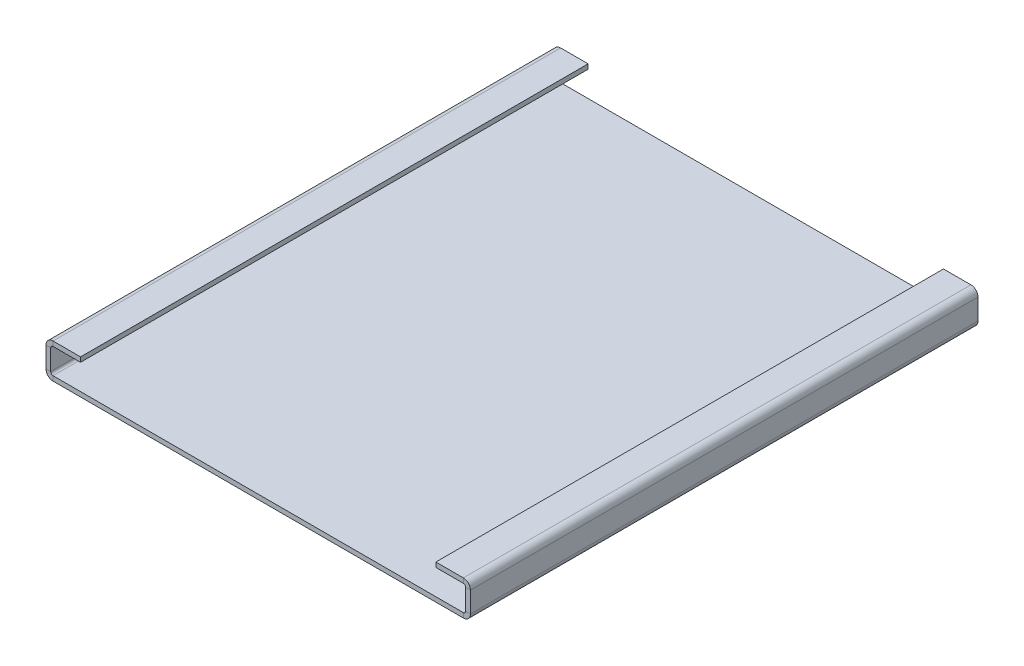
ISO-10303-21;
HEADER;
FILE_DESCRIPTION(('STEP AP214'),'2;1');
FILE_NAME('part.step','',(''),(''),'','','');
FILE_SCHEMA(('AUTOMOTIVE_DESIGN { 1 0 10303 214 1 1 1 1 }'));
ENDSEC;
DATA;
#1=APPLICATION_CONTEXT('core data for automotive mechanical design processes');
#2=APPLICATION_PROTOCOL_DEFINITION('international standard','automotive_design',2000,#1);
#3=PRODUCT_CONTEXT('',#1,'mechanical');
#4=PRODUCT('Part','Part','',(#3));
#5=PRODUCT_RELATED_PRODUCT_CATEGORY('part','',(#4));
#6=PRODUCT_DEFINITION_FORMATION('','',#4);
#7=PRODUCT_DEFINITION_CONTEXT('part definition',#1,'design');
#8=PRODUCT_DEFINITION('design','',#6,#7);
#9=PRODUCT_DEFINITION_SHAPE('','',#8);
#10=(LENGTH_UNIT() NAMED_UNIT(*) SI_UNIT(.MILLI.,.METRE.));
#11=(NAMED_UNIT(*) PLANE_ANGLE_UNIT() SI_UNIT($,.RADIAN.));
#12=(NAMED_UNIT(*) SI_UNIT($,.STERADIAN.) SOLID_ANGLE_UNIT());
#13=UNCERTAINTY_MEASURE_WITH_UNIT(LENGTH_MEASURE(1.E-05),#10,'distance_accuracy_value','');
#14=(GEOMETRIC_REPRESENTATION_CONTEXT(3) GLOBAL_UNCERTAINTY_ASSIGNED_CONTEXT((#13)) GLOBAL_UNIT_ASSIGNED_CONTEXT((#10,
#11,#12)) REPRESENTATION_CONTEXT('',''));
#15=CARTESIAN_POINT('',(0.,0.,0.));
#16=DIRECTION('',(0.,0.,1.));
#17=DIRECTION('',(1.,0.,0.));
#18=AXIS2_PLACEMENT_3D('',#15,#16,#17);
#19=CARTESIAN_POINT('',(17.653,0.,-21.59));
#20=DIRECTION('',(0.,0.,1.));
#21=DIRECTION('',(0.,-1.,0.));
#22=AXIS2_PLACEMENT_3D('',#19,#20,#21);
#23=PLANE('',#22);
#24=DIRECTION('',(-1.,0.,0.));
#25=VECTOR('',#24,1.);
#26=CARTESIAN_POINT('',(17.653,1.958999892,-21.59));
#27=LINE('',#26,#25);
#28=CARTESIAN_POINT('',(18.052999962,1.958999892,-21.59));
#29=VERTEX_POINT('',#28);
#30=CARTESIAN_POINT('',(17.653,1.958999892,-21.59));
#31=VERTEX_POINT('',#30);
#32=EDGE_CURVE('E13',#29,#31,#27,.T.);
#33=ORIENTED_EDGE('',*,*,#32,.F.);
#34=DIRECTION('',(0.,1.,0.));
#35=VECTOR('',#34,1.);
#36=CARTESIAN_POINT('',(18.052999962,0.,-21.59));
#37=LINE('',#36,#35);
#38=CARTESIAN_POINT('',(18.052999962,0.200000107999998,-21.59));
#39=VERTEX_POINT('',#38);
#40=EDGE_CURVE('E137',#29,#39,#37,.F.);
#41=ORIENTED_EDGE('',*,*,#40,.T.);
#42=DIRECTION('',(-1.,0.,0.));
#43=VECTOR('',#42,1.);
#44=CARTESIAN_POINT('',(17.653,0.200000107999998,-21.59));
#45=LINE('',#44,#43);
#46=CARTESIAN_POINT('',(17.653,0.200000107999998,-21.59));
#47=VERTEX_POINT('',#46);
#48=EDGE_CURVE('E61',#39,#47,#45,.T.);
#49=ORIENTED_EDGE('',*,*,#48,.T.);
#50=DIRECTION('',(0.,-1.,0.));
#51=VECTOR('',#50,1.);
#52=CARTESIAN_POINT('',(17.653,0.,-21.59));
#53=LINE('',#52,#51);
#54=EDGE_CURVE('E140',#31,#47,#53,.T.);
#55=ORIENTED_EDGE('',*,*,#54,.F.);
#56=EDGE_LOOP('',(#33,#41,#49,#55));
#57=FACE_BOUND('',#56,.T.);
#58=ADVANCED_FACE('F51',(#57),#23,.F.);
#59=CARTESIAN_POINT('',(17.452999892,0.200000107999998,-21.59));
#60=DIRECTION('',(0.,0.,-1.));
#61=DIRECTION('',(-1.,0.,0.));
#62=AXIS2_PLACEMENT_3D('',#59,#60,#61);
#63=PLANE('',#62);
#64=ORIENTED_EDGE('',*,*,#48,.F.);
#65=CARTESIAN_POINT('',(17.452999892,0.200000107999998,-21.59));
#66=DIRECTION('',(0.,0.,1.));
#67=DIRECTION('',(1.,0.,0.));
#68=AXIS2_PLACEMENT_3D('',#65,#66,#67);
#69=CIRCLE('',#68,0.60000007);
#70=CARTESIAN_POINT('',(17.452999892,-0.399999962000002,-21.59));
#71=VERTEX_POINT('',#70);
#72=EDGE_CURVE('E179',#39,#71,#69,.F.);
#73=ORIENTED_EDGE('',*,*,#72,.T.);
#74=DIRECTION('',(0.,1.,0.));
#75=VECTOR('',#74,1.);
#76=CARTESIAN_POINT('',(17.452999892,0.,-21.59));
#77=LINE('',#76,#75);
#78=CARTESIAN_POINT('',(17.452999892,0.,-21.59));
#79=VERTEX_POINT('',#78);
#80=EDGE_CURVE('E228',#71,#79,#77,.T.);
#81=ORIENTED_EDGE('',*,*,#80,.T.);
#82=CARTESIAN_POINT('',(17.452999892,0.200000107999998,-21.59));
#83=DIRECTION('',(0.,0.,1.));
#84=DIRECTION('',(1.,0.,0.));
#85=AXIS2_PLACEMENT_3D('',#82,#83,#84);
#86=CIRCLE('',#85,0.200000108);
#87=EDGE_CURVE('E250',#47,#79,#86,.F.);
#88=ORIENTED_EDGE('',*,*,#87,.F.);
#89=EDGE_LOOP('',(#64,#73,#81,#88));
#90=FACE_BOUND('',#89,.T.);
#91=ADVANCED_FACE('F251',(#90),#63,.T.);
#92=CARTESIAN_POINT('',(17.653,0.,-21.59));
#93=DIRECTION('',(0.,0.,1.));
#94=DIRECTION('',(-1.,0.,0.));
#95=AXIS2_PLACEMENT_3D('',#92,#93,#94);
#96=PLANE('',#95);
#97=ORIENTED_EDGE('',*,*,#80,.F.);
#98=DIRECTION('',(1.,0.,0.));
#99=VECTOR('',#98,1.);
#100=CARTESIAN_POINT('',(17.653,-0.399999962000002,-21.59));
#101=LINE('',#100,#99);
#102=CARTESIAN_POINT('',(-17.452999892,-0.399999962000007,-21.59));
#103=VERTEX_POINT('',#102);
#104=EDGE_CURVE('E324',#71,#103,#101,.F.);
#105=ORIENTED_EDGE('',*,*,#104,.T.);
#106=DIRECTION('',(0.,1.,0.));
#107=VECTOR('',#106,1.);
#108=CARTESIAN_POINT('',(-17.452999892,0.,-21.59));
#109=LINE('',#108,#107);
#110=CARTESIAN_POINT('',(-17.452999892,0.,-21.59));
#111=VERTEX_POINT('',#110);
#112=EDGE_CURVE('E225',#103,#111,#109,.T.);
#113=ORIENTED_EDGE('',*,*,#112,.T.);
#114=DIRECTION('',(-1.,0.,0.));
#115=VECTOR('',#114,1.);
#116=CARTESIAN_POINT('',(17.653,0.,-21.59));
#117=LINE('',#116,#115);
#118=EDGE_CURVE('E363',#79,#111,#117,.T.);
#119=ORIENTED_EDGE('',*,*,#118,.F.);
#120=EDGE_LOOP('',(#97,#105,#113,#119));
#121=FACE_BOUND('',#120,.T.);
#122=ADVANCED_FACE('F360',(#121),#96,.F.);
#123=CARTESIAN_POINT('',(-17.452999892,0.200000107999993,-21.59));
#124=DIRECTION('',(0.,0.,-1.));
#125=DIRECTION('',(-1.,0.,0.));
#126=AXIS2_PLACEMENT_3D('',#123,#124,#125);
#127=PLANE('',#126);
#128=ORIENTED_EDGE('',*,*,#112,.F.);
#129=CARTESIAN_POINT('',(-17.452999892,0.200000107999993,-21.59));
#130=DIRECTION('',(0.,0.,1.));
#131=DIRECTION('',(1.,0.,0.));
#132=AXIS2_PLACEMENT_3D('',#129,#130,#131);
#133=CIRCLE('',#132,0.60000007);
#134=CARTESIAN_POINT('',(-18.052999962,0.200000107999994,-21.59));
#135=VERTEX_POINT('',#134);
#136=EDGE_CURVE('E328',#103,#135,#133,.F.);
#137=ORIENTED_EDGE('',*,*,#136,.T.);
#138=DIRECTION('',(1.,0.,0.));
#139=VECTOR('',#138,1.);
#140=CARTESIAN_POINT('',(-17.653,0.200000107999993,-21.59));
#141=LINE('',#140,#139);
#142=CARTESIAN_POINT('',(-17.653,0.200000107999993,-21.59));
#143=VERTEX_POINT('',#142);
#144=EDGE_CURVE('E222',#135,#143,#141,.T.);
#145=ORIENTED_EDGE('',*,*,#144,.T.);
#146=CARTESIAN_POINT('',(-17.452999892,0.200000107999993,-21.59));
#147=DIRECTION('',(0.,0.,1.));
#148=DIRECTION('',(1.,0.,0.));
#149=AXIS2_PLACEMENT_3D('',#146,#147,#148);
#150=CIRCLE('',#149,0.200000108);
#151=EDGE_CURVE('E279',#111,#143,#150,.F.);
#152=ORIENTED_EDGE('',*,*,#151,.F.);
#153=EDGE_LOOP('',(#128,#137,#145,#152));
#154=FACE_BOUND('',#153,.T.);
#155=ADVANCED_FACE('F464',(#154),#127,.T.);
#156=CARTESIAN_POINT('',(-17.653,0.,-21.59));
#157=DIRECTION('',(0.,0.,1.));
#158=DIRECTION('',(0.,1.,0.));
#159=AXIS2_PLACEMENT_3D('',#156,#157,#158);
#160=PLANE('',#159);
#161=ORIENTED_EDGE('',*,*,#144,.F.);
#162=DIRECTION('',(0.,1.,0.));
#163=VECTOR('',#162,1.);
#164=CARTESIAN_POINT('',(-18.052999962,0.,-21.59));
#165=LINE('',#164,#163);
#166=CARTESIAN_POINT('',(-18.052999962,1.95899989199999,-21.59));
#167=VERTEX_POINT('',#166);
#168=EDGE_CURVE('E176',#135,#167,#165,.T.);
#169=ORIENTED_EDGE('',*,*,#168,.T.);
#170=DIRECTION('',(1.,0.,0.));
#171=VECTOR('',#170,1.);
#172=CARTESIAN_POINT('',(-17.653,1.95899989199999,-21.59));
#173=LINE('',#172,#171);
#174=CARTESIAN_POINT('',(-17.653,1.95899989199999,-21.59));
#175=VERTEX_POINT('',#174);
#176=EDGE_CURVE('E69',#167,#175,#173,.T.);
#177=ORIENTED_EDGE('',*,*,#176,.T.);
#178=DIRECTION('',(0.,1.,0.));
#179=VECTOR('',#178,1.);
#180=CARTESIAN_POINT('',(-17.653,0.,-21.59));
#181=LINE('',#180,#179);
#182=EDGE_CURVE('E434',#143,#175,#181,.T.);
#183=ORIENTED_EDGE('',*,*,#182,.F.);
#184=EDGE_LOOP('',(#161,#169,#177,#183));
#185=FACE_BOUND('',#184,.T.);
#186=ADVANCED_FACE('F467',(#185),#160,.F.);
#187=CARTESIAN_POINT('',(-17.452999892,1.95899989199999,-21.59));
#188=DIRECTION('',(0.,0.,-1.));
#189=DIRECTION('',(-1.,0.,0.));
#190=AXIS2_PLACEMENT_3D('',#187,#188,#189);
#191=PLANE('',#190);
#192=ORIENTED_EDGE('',*,*,#176,.F.);
#193=CARTESIAN_POINT('',(-17.452999892,1.95899989199999,-21.59));
#194=DIRECTION('',(0.,0.,1.));
#195=DIRECTION('',(1.,0.,0.));
#196=AXIS2_PLACEMENT_3D('',#193,#194,#195);
#197=CIRCLE('',#196,0.60000007);
#198=CARTESIAN_POINT('',(-17.452999892,2.55899996199999,-21.59));
#199=VERTEX_POINT('',#198);
#200=EDGE_CURVE('E335',#167,#199,#197,.F.);
#201=ORIENTED_EDGE('',*,*,#200,.T.);
#202=DIRECTION('',(0.,-1.,0.));
#203=VECTOR('',#202,1.);
#204=CARTESIAN_POINT('',(-17.452999892,2.15899999999999,-21.59));
#205=LINE('',#204,#203);
#206=CARTESIAN_POINT('',(-17.452999892,2.15899999999999,-21.59));
#207=VERTEX_POINT('',#206);
#208=EDGE_CURVE('E218',#199,#207,#205,.T.);
#209=ORIENTED_EDGE('',*,*,#208,.T.);
#210=CARTESIAN_POINT('',(-17.452999892,1.95899989199999,-21.59));
#211=DIRECTION('',(0.,0.,1.));
#212=DIRECTION('',(1.,0.,0.));
#213=AXIS2_PLACEMENT_3D('',#210,#211,#212);
#214=CIRCLE('',#213,0.200000108);
#215=EDGE_CURVE('E290',#175,#207,#214,.F.);
#216=ORIENTED_EDGE('',*,*,#215,.F.);
#217=EDGE_LOOP('',(#192,#201,#209,#216));
#218=FACE_BOUND('',#217,.T.);
#219=ADVANCED_FACE('F471',(#218),#191,.T.);
#220=CARTESIAN_POINT('',(-17.653,2.15899999999999,-21.59));
#221=DIRECTION('',(0.,0.,1.));
#222=DIRECTION('',(1.,0.,0.));
#223=AXIS2_PLACEMENT_3D('',#220,#221,#222);
#224=PLANE('',#223);
#225=ORIENTED_EDGE('',*,*,#208,.F.);
#226=DIRECTION('',(1.,0.,0.));
#227=VECTOR('',#226,1.);
#228=CARTESIAN_POINT('',(-17.653,2.55899996199999,-21.59));
#229=LINE('',#228,#227);
#230=CARTESIAN_POINT('',(-15.113,2.55899996199999,-21.59));
#231=VERTEX_POINT('',#230);
#232=EDGE_CURVE('E323',#199,#231,#229,.T.);
#233=ORIENTED_EDGE('',*,*,#232,.T.);
#234=DIRECTION('',(0.,-1.,0.));
#235=VECTOR('',#234,1.);
#236=CARTESIAN_POINT('',(-15.113,2.15899999999999,-21.59));
#237=LINE('',#236,#235);
#238=CARTESIAN_POINT('',(-15.113,2.15899999999999,-21.59));
#239=VERTEX_POINT('',#238);
#240=EDGE_CURVE('E215',#231,#239,#237,.T.);
#241=ORIENTED_EDGE('',*,*,#240,.T.);
#242=DIRECTION('',(1.,0.,0.));
#243=VECTOR('',#242,1.);
#244=CARTESIAN_POINT('',(-17.653,2.15899999999999,-21.59));
#245=LINE('',#244,#243);
#246=EDGE_CURVE('E413',#207,#239,#245,.T.);
#247=ORIENTED_EDGE('',*,*,#246,.F.);
#248=EDGE_LOOP('',(#225,#233,#241,#247));
#249=FACE_BOUND('',#248,.T.);
#250=ADVANCED_FACE('F414',(#249),#224,.F.);
#251=CARTESIAN_POINT('',(-15.113,2.15899999999999,21.59));
#252=DIRECTION('',(1.,0.,0.));
#253=DIRECTION('',(0.,0.,-1.));
#254=AXIS2_PLACEMENT_3D('',#251,#252,#253);
#255=PLANE('',#254);
#256=ORIENTED_EDGE('',*,*,#240,.F.);
#257=DIRECTION('',(0.,0.,1.));
#258=VECTOR('',#257,1.);
#259=CARTESIAN_POINT('',(-15.113,2.55899996199999,21.59));
#260=LINE('',#259,#258);
#261=CARTESIAN_POINT('',(-15.113,2.55899996199999,21.59));
#262=VERTEX_POINT('',#261);
#263=EDGE_CURVE('E338',#262,#231,#260,.F.);
#264=ORIENTED_EDGE('',*,*,#263,.F.);
#265=DIRECTION('',(0.,-1.,0.));
#266=VECTOR('',#265,1.);
#267=CARTESIAN_POINT('',(-15.113,2.15899999999999,21.59));
#268=LINE('',#267,#266);
#269=CARTESIAN_POINT('',(-15.113,2.15899999999999,21.59));
#270=VERTEX_POINT('',#269);
#271=EDGE_CURVE('E212',#262,#270,#268,.T.);
#272=ORIENTED_EDGE('',*,*,#271,.T.);
#273=DIRECTION('',(0.,0.,-1.));
#274=VECTOR('',#273,1.);
#275=CARTESIAN_POINT('',(-15.113,2.15899999999999,21.59));
#276=LINE('',#275,#274);
#277=EDGE_CURVE('E402',#270,#239,#276,.T.);
#278=ORIENTED_EDGE('',*,*,#277,.T.);
#279=EDGE_LOOP('',(#256,#264,#272,#278));
#280=FACE_BOUND('',#279,.T.);
#281=ADVANCED_FACE('F476',(#280),#255,.T.);
#282=CARTESIAN_POINT('',(-17.653,2.15899999999999,21.59));
#283=DIRECTION('',(0.,0.,1.));
#284=DIRECTION('',(1.,0.,0.));
#285=AXIS2_PLACEMENT_3D('',#282,#283,#284);
#286=PLANE('',#285);
#287=ORIENTED_EDGE('',*,*,#271,.F.);
#288=DIRECTION('',(1.,0.,0.));
#289=VECTOR('',#288,1.);
#290=CARTESIAN_POINT('',(-17.653,2.55899996199999,21.59));
#291=LINE('',#290,#289);
#292=CARTESIAN_POINT('',(-17.452999892,2.55899996199999,21.59));
#293=VERTEX_POINT('',#292);
#294=EDGE_CURVE('E169',#293,#262,#291,.T.);
#295=ORIENTED_EDGE('',*,*,#294,.F.);
#296=DIRECTION('',(0.,-1.,0.));
#297=VECTOR('',#296,1.);
#298=CARTESIAN_POINT('',(-17.452999892,2.15899999999999,21.59));
#299=LINE('',#298,#297);
#300=CARTESIAN_POINT('',(-17.452999892,2.15899999999999,21.59));
#301=VERTEX_POINT('',#300);
#302=EDGE_CURVE('E209',#293,#301,#299,.T.);
#303=ORIENTED_EDGE('',*,*,#302,.T.);
#304=DIRECTION('',(1.,0.,0.));
#305=VECTOR('',#304,1.);
#306=CARTESIAN_POINT('',(-17.653,2.15899999999999,21.59));
#307=LINE('',#306,#305);
#308=EDGE_CURVE('E247',#301,#270,#307,.T.);
#309=ORIENTED_EDGE('',*,*,#308,.T.);
#310=EDGE_LOOP('',(#287,#295,#303,#309));
#311=FACE_BOUND('',#310,.T.);
#312=ADVANCED_FACE('F391',(#311),#286,.T.);
#313=CARTESIAN_POINT('',(-17.452999892,1.95899989199999,21.59));
#314=DIRECTION('',(0.,0.,1.));
#315=DIRECTION('',(1.,0.,0.));
#316=AXIS2_PLACEMENT_3D('',#313,#314,#315);
#317=PLANE('',#316);
#318=ORIENTED_EDGE('',*,*,#302,.F.);
#319=CARTESIAN_POINT('',(-17.452999892,1.95899989199999,21.59));
#320=DIRECTION('',(0.,0.,1.));
#321=DIRECTION('',(1.,0.,0.));
#322=AXIS2_PLACEMENT_3D('',#319,#320,#321);
#323=CIRCLE('',#322,0.60000007);
#324=CARTESIAN_POINT('',(-18.052999962,1.95899989199999,21.59));
#325=VERTEX_POINT('',#324);
#326=EDGE_CURVE('E332',#293,#325,#323,.T.);
#327=ORIENTED_EDGE('',*,*,#326,.T.);
#328=DIRECTION('',(1.,0.,0.));
#329=VECTOR('',#328,1.);
#330=CARTESIAN_POINT('',(-17.653,1.95899989199999,21.59));
#331=LINE('',#330,#329);
#332=CARTESIAN_POINT('',(-17.653,1.95899989199999,21.59));
#333=VERTEX_POINT('',#332);
#334=EDGE_CURVE('E207',#325,#333,#331,.T.);
#335=ORIENTED_EDGE('',*,*,#334,.T.);
#336=CARTESIAN_POINT('',(-17.452999892,1.95899989199999,21.59));
#337=DIRECTION('',(0.,0.,-1.));
#338=DIRECTION('',(-1.,0.,0.));
#339=AXIS2_PLACEMENT_3D('',#336,#337,#338);
#340=CIRCLE('',#339,0.200000108);
#341=EDGE_CURVE('E282',#301,#333,#340,.F.);
#342=ORIENTED_EDGE('',*,*,#341,.F.);
#343=EDGE_LOOP('',(#318,#327,#335,#342));
#344=FACE_BOUND('',#343,.T.);
#345=ADVANCED_FACE('F404',(#344),#317,.T.);
#346=CARTESIAN_POINT('',(-17.653,0.,21.59));
#347=DIRECTION('',(0.,0.,1.));
#348=DIRECTION('',(0.,1.,0.));
#349=AXIS2_PLACEMENT_3D('',#346,#347,#348);
#350=PLANE('',#349);
#351=ORIENTED_EDGE('',*,*,#334,.F.);
#352=DIRECTION('',(0.,1.,0.));
#353=VECTOR('',#352,1.);
#354=CARTESIAN_POINT('',(-18.052999962,0.,21.59));
#355=LINE('',#354,#353);
#356=CARTESIAN_POINT('',(-18.052999962,0.200000107999993,21.59));
#357=VERTEX_POINT('',#356);
#358=EDGE_CURVE('E329',#357,#325,#355,.T.);
#359=ORIENTED_EDGE('',*,*,#358,.F.);
#360=DIRECTION('',(1.,0.,0.));
#361=VECTOR('',#360,1.);
#362=CARTESIAN_POINT('',(-17.653,0.200000107999993,21.59));
#363=LINE('',#362,#361);
#364=CARTESIAN_POINT('',(-17.653,0.200000107999993,21.59));
#365=VERTEX_POINT('',#364);
#366=EDGE_CURVE('E204',#357,#365,#363,.T.);
#367=ORIENTED_EDGE('',*,*,#366,.T.);
#368=DIRECTION('',(0.,1.,0.));
#369=VECTOR('',#368,1.);
#370=CARTESIAN_POINT('',(-17.653,0.,21.59));
#371=LINE('',#370,#369);
#372=EDGE_CURVE('E370',#365,#333,#371,.T.);
#373=ORIENTED_EDGE('',*,*,#372,.T.);
#374=EDGE_LOOP('',(#351,#359,#367,#373));
#375=FACE_BOUND('',#374,.T.);
#376=ADVANCED_FACE('F443',(#375),#350,.T.);
#377=CARTESIAN_POINT('',(-17.452999892,0.200000107999993,21.59));
#378=DIRECTION('',(0.,0.,1.));
#379=DIRECTION('',(1.,0.,0.));
#380=AXIS2_PLACEMENT_3D('',#377,#378,#379);
#381=PLANE('',#380);
#382=ORIENTED_EDGE('',*,*,#366,.F.);
#383=CARTESIAN_POINT('',(-17.452999892,0.200000107999993,21.59));
#384=DIRECTION('',(0.,0.,1.));
#385=DIRECTION('',(1.,0.,0.));
#386=AXIS2_PLACEMENT_3D('',#383,#384,#385);
#387=CIRCLE('',#386,0.60000007);
#388=CARTESIAN_POINT('',(-17.452999892,-0.399999962000007,21.59));
#389=VERTEX_POINT('',#388);
#390=EDGE_CURVE('E325',#357,#389,#387,.T.);
#391=ORIENTED_EDGE('',*,*,#390,.T.);
#392=DIRECTION('',(0.,1.,0.));
#393=VECTOR('',#392,1.);
#394=CARTESIAN_POINT('',(-17.452999892,0.,21.59));
#395=LINE('',#394,#393);
#396=CARTESIAN_POINT('',(-17.452999892,0.,21.59));
#397=VERTEX_POINT('',#396);
#398=EDGE_CURVE('E201',#389,#397,#395,.T.);
#399=ORIENTED_EDGE('',*,*,#398,.T.);
#400=CARTESIAN_POINT('',(-17.452999892,0.200000107999993,21.59));
#401=DIRECTION('',(0.,0.,-1.));
#402=DIRECTION('',(-1.,0.,0.));
#403=AXIS2_PLACEMENT_3D('',#400,#401,#402);
#404=CIRCLE('',#403,0.200000108);
#405=EDGE_CURVE('E257',#365,#397,#404,.F.);
#406=ORIENTED_EDGE('',*,*,#405,.F.);
#407=EDGE_LOOP('',(#382,#391,#399,#406));
#408=FACE_BOUND('',#407,.T.);
#409=ADVANCED_FACE('F486',(#408),#381,.T.);
#410=CARTESIAN_POINT('',(17.653,0.,21.59));
#411=DIRECTION('',(0.,0.,1.));
#412=DIRECTION('',(-1.,0.,0.));
#413=AXIS2_PLACEMENT_3D('',#410,#411,#412);
#414=PLANE('',#413);
#415=ORIENTED_EDGE('',*,*,#398,.F.);
#416=DIRECTION('',(1.,0.,0.));
#417=VECTOR('',#416,1.);
#418=CARTESIAN_POINT('',(17.653,-0.399999962000002,21.59));
#419=LINE('',#418,#417);
#420=CARTESIAN_POINT('',(17.452999892,-0.399999962000002,21.59));
#421=VERTEX_POINT('',#420);
#422=EDGE_CURVE('E320',#421,#389,#419,.F.);
#423=ORIENTED_EDGE('',*,*,#422,.F.);
#424=DIRECTION('',(0.,1.,0.));
#425=VECTOR('',#424,1.);
#426=CARTESIAN_POINT('',(17.452999892,0.,21.59));
#427=LINE('',#426,#425);
#428=CARTESIAN_POINT('',(17.452999892,0.,21.59));
#429=VERTEX_POINT('',#428);
#430=EDGE_CURVE('E198',#421,#429,#427,.T.);
#431=ORIENTED_EDGE('',*,*,#430,.T.);
#432=DIRECTION('',(-1.,0.,0.));
#433=VECTOR('',#432,1.);
#434=CARTESIAN_POINT('',(17.653,0.,21.59));
#435=LINE('',#434,#433);
#436=EDGE_CURVE('E369',#429,#397,#435,.T.);
#437=ORIENTED_EDGE('',*,*,#436,.T.);
#438=EDGE_LOOP('',(#415,#423,#431,#437));
#439=FACE_BOUND('',#438,.T.);
#440=ADVANCED_FACE('F489',(#439),#414,.T.);
#441=CARTESIAN_POINT('',(17.452999892,0.200000107999998,21.59));
#442=DIRECTION('',(0.,0.,1.));
#443=DIRECTION('',(1.,0.,0.));
#444=AXIS2_PLACEMENT_3D('',#441,#442,#443);
#445=PLANE('',#444);
#446=ORIENTED_EDGE('',*,*,#430,.F.);
#447=CARTESIAN_POINT('',(17.452999892,0.200000107999998,21.59));
#448=DIRECTION('',(0.,0.,1.));
#449=DIRECTION('',(1.,0.,0.));
#450=AXIS2_PLACEMENT_3D('',#447,#448,#449);
#451=CIRCLE('',#450,0.60000007);
#452=CARTESIAN_POINT('',(18.052999962,0.200000107999998,21.59));
#453=VERTEX_POINT('',#452);
#454=EDGE_CURVE('E174',#421,#453,#451,.T.);
#455=ORIENTED_EDGE('',*,*,#454,.T.);
#456=DIRECTION('',(-1.,0.,0.));
#457=VECTOR('',#456,1.);
#458=CARTESIAN_POINT('',(17.653,0.200000107999998,21.59));
#459=LINE('',#458,#457);
#460=CARTESIAN_POINT('',(17.653,0.200000107999998,21.59));
#461=VERTEX_POINT('',#460);
#462=EDGE_CURVE('E195',#453,#461,#459,.T.);
#463=ORIENTED_EDGE('',*,*,#462,.T.);
#464=CARTESIAN_POINT('',(17.452999892,0.200000107999998,21.59));
#465=DIRECTION('',(0.,0.,-1.));
#466=DIRECTION('',(-1.,0.,0.));
#467=AXIS2_PLACEMENT_3D('',#464,#465,#466);
#468=CIRCLE('',#467,0.200000108);
#469=EDGE_CURVE('E256',#429,#461,#468,.F.);
#470=ORIENTED_EDGE('',*,*,#469,.F.);
#471=EDGE_LOOP('',(#446,#455,#463,#470));
#472=FACE_BOUND('',#471,.T.);
#473=ADVANCED_FACE('F493',(#472),#445,.T.);
#474=CARTESIAN_POINT('',(17.653,0.,21.59));
#475=DIRECTION('',(0.,0.,1.));
#476=DIRECTION('',(0.,-1.,0.));
#477=AXIS2_PLACEMENT_3D('',#474,#475,#476);
#478=PLANE('',#477);
#479=ORIENTED_EDGE('',*,*,#462,.F.);
#480=DIRECTION('',(0.,1.,0.));
#481=VECTOR('',#480,1.);
#482=CARTESIAN_POINT('',(18.052999962,0.,21.59));
#483=LINE('',#482,#481);
#484=CARTESIAN_POINT('',(18.052999962,1.958999892,21.59));
#485=VERTEX_POINT('',#484);
#486=EDGE_CURVE('E168',#485,#453,#483,.F.);
#487=ORIENTED_EDGE('',*,*,#486,.F.);
#488=DIRECTION('',(-1.,0.,0.));
#489=VECTOR('',#488,1.);
#490=CARTESIAN_POINT('',(17.653,1.958999892,21.59));
#491=LINE('',#490,#489);
#492=CARTESIAN_POINT('',(17.653,1.958999892,21.59));
#493=VERTEX_POINT('',#492);
#494=EDGE_CURVE('E192',#485,#493,#491,.T.);
#495=ORIENTED_EDGE('',*,*,#494,.T.);
#496=DIRECTION('',(0.,-1.,0.));
#497=VECTOR('',#496,1.);
#498=CARTESIAN_POINT('',(17.653,0.,21.59));
#499=LINE('',#498,#497);
#500=EDGE_CURVE('E246',#493,#461,#499,.T.);
#501=ORIENTED_EDGE('',*,*,#500,.T.);
#502=EDGE_LOOP('',(#479,#487,#495,#501));
#503=FACE_BOUND('',#502,.T.);
#504=ADVANCED_FACE('F496',(#503),#478,.T.);
#505=CARTESIAN_POINT('',(17.452999892,1.958999892,21.59));
#506=DIRECTION('',(0.,0.,1.));
#507=DIRECTION('',(1.,0.,0.));
#508=AXIS2_PLACEMENT_3D('',#505,#506,#507);
#509=PLANE('',#508);
#510=ORIENTED_EDGE('',*,*,#494,.F.);
#511=CARTESIAN_POINT('',(17.452999892,1.958999892,21.59));
#512=DIRECTION('',(0.,0.,1.));
#513=DIRECTION('',(1.,0.,0.));
#514=AXIS2_PLACEMENT_3D('',#511,#512,#513);
#515=CIRCLE('',#514,0.60000007);
#516=CARTESIAN_POINT('',(17.452999892,2.558999962,21.59));
#517=VERTEX_POINT('',#516);
#518=EDGE_CURVE('E156',#485,#517,#515,.T.);
#519=ORIENTED_EDGE('',*,*,#518,.T.);
#520=DIRECTION('',(0.,-1.,0.));
#521=VECTOR('',#520,1.);
#522=CARTESIAN_POINT('',(17.452999892,2.159,21.59));
#523=LINE('',#522,#521);
#524=CARTESIAN_POINT('',(17.452999892,2.159,21.59));
#525=VERTEX_POINT('',#524);
#526=EDGE_CURVE('E189',#517,#525,#523,.T.);
#527=ORIENTED_EDGE('',*,*,#526,.T.);
#528=CARTESIAN_POINT('',(17.452999892,1.958999892,21.59));
#529=DIRECTION('',(0.,0.,-1.));
#530=DIRECTION('',(-1.,0.,0.));
#531=AXIS2_PLACEMENT_3D('',#528,#529,#530);
#532=CIRCLE('',#531,0.200000108);
#533=EDGE_CURVE('E432',#493,#525,#532,.F.);
#534=ORIENTED_EDGE('',*,*,#533,.F.);
#535=EDGE_LOOP('',(#510,#519,#527,#534));
#536=FACE_BOUND('',#535,.T.);
#537=ADVANCED_FACE('F500',(#536),#509,.T.);
#538=CARTESIAN_POINT('',(17.653,2.159,21.59));
#539=DIRECTION('',(0.,0.,1.));
#540=DIRECTION('',(1.,0.,0.));
#541=AXIS2_PLACEMENT_3D('',#538,#539,#540);
#542=PLANE('',#541);
#543=ORIENTED_EDGE('',*,*,#526,.F.);
#544=DIRECTION('',(-1.,0.,0.));
#545=VECTOR('',#544,1.);
#546=CARTESIAN_POINT('',(17.653,2.558999962,21.59));
#547=LINE('',#546,#545);
#548=CARTESIAN_POINT('',(15.113,2.558999962,21.59));
#549=VERTEX_POINT('',#548);
#550=EDGE_CURVE('E314',#549,#517,#547,.F.);
#551=ORIENTED_EDGE('',*,*,#550,.F.);
#552=DIRECTION('',(0.,-1.,0.));
#553=VECTOR('',#552,1.);
#554=CARTESIAN_POINT('',(15.113,2.159,21.59));
#555=LINE('',#554,#553);
#556=CARTESIAN_POINT('',(15.113,2.159,21.59));
#557=VERTEX_POINT('',#556);
#558=EDGE_CURVE('E186',#549,#557,#555,.T.);
#559=ORIENTED_EDGE('',*,*,#558,.T.);
#560=DIRECTION('',(1.,0.,0.));
#561=VECTOR('',#560,1.);
#562=CARTESIAN_POINT('',(17.653,2.159,21.59));
#563=LINE('',#562,#561);
#564=EDGE_CURVE('E423',#557,#525,#563,.T.);
#565=ORIENTED_EDGE('',*,*,#564,.T.);
#566=EDGE_LOOP('',(#543,#551,#559,#565));
#567=FACE_BOUND('',#566,.T.);
#568=ADVANCED_FACE('F504',(#567),#542,.T.);
#569=CARTESIAN_POINT('',(15.113,2.159,21.59));
#570=DIRECTION('',(1.,0.,0.));
#571=DIRECTION('',(0.,0.,-1.));
#572=AXIS2_PLACEMENT_3D('',#569,#570,#571);
#573=PLANE('',#572);
#574=ORIENTED_EDGE('',*,*,#558,.F.);
#575=DIRECTION('',(0.,0.,1.));
#576=VECTOR('',#575,1.);
#577=CARTESIAN_POINT('',(15.113,2.558999962,21.59));
#578=LINE('',#577,#576);
#579=CARTESIAN_POINT('',(15.113,2.558999962,-21.59));
#580=VERTEX_POINT('',#579);
#581=EDGE_CURVE('E161',#549,#580,#578,.F.);
#582=ORIENTED_EDGE('',*,*,#581,.T.);
#583=DIRECTION('',(0.,-1.,0.));
#584=VECTOR('',#583,1.);
#585=CARTESIAN_POINT('',(15.113,2.159,-21.59));
#586=LINE('',#585,#584);
#587=CARTESIAN_POINT('',(15.113,2.159,-21.59));
#588=VERTEX_POINT('',#587);
#589=EDGE_CURVE('E183',#580,#588,#586,.T.);
#590=ORIENTED_EDGE('',*,*,#589,.T.);
#591=DIRECTION('',(0.,0.,-1.));
#592=VECTOR('',#591,1.);
#593=CARTESIAN_POINT('',(15.113,2.159,21.59));
#594=LINE('',#593,#592);
#595=EDGE_CURVE('E426',#557,#588,#594,.T.);
#596=ORIENTED_EDGE('',*,*,#595,.F.);
#597=EDGE_LOOP('',(#574,#582,#590,#596));
#598=FACE_BOUND('',#597,.T.);
#599=ADVANCED_FACE('F508',(#598),#573,.F.);
#600=CARTESIAN_POINT('',(17.653,2.159,-21.59));
#601=DIRECTION('',(0.,0.,1.));
#602=DIRECTION('',(1.,0.,0.));
#603=AXIS2_PLACEMENT_3D('',#600,#601,#602);
#604=PLANE('',#603);
#605=ORIENTED_EDGE('',*,*,#589,.F.);
#606=DIRECTION('',(-1.,0.,0.));
#607=VECTOR('',#606,1.);
#608=CARTESIAN_POINT('',(17.653,2.558999962,-21.59));
#609=LINE('',#608,#607);
#610=CARTESIAN_POINT('',(17.452999892,2.558999962,-21.59));
#611=VERTEX_POINT('',#610);
#612=EDGE_CURVE('E312',#580,#611,#609,.F.);
#613=ORIENTED_EDGE('',*,*,#612,.T.);
#614=DIRECTION('',(0.,-1.,0.));
#615=VECTOR('',#614,1.);
#616=CARTESIAN_POINT('',(17.452999892,2.159,-21.59));
#617=LINE('',#616,#615);
#618=CARTESIAN_POINT('',(17.452999892,2.159,-21.59));
#619=VERTEX_POINT('',#618);
#620=EDGE_CURVE('E55',#611,#619,#617,.T.);
#621=ORIENTED_EDGE('',*,*,#620,.T.);
#622=DIRECTION('',(1.,0.,0.));
#623=VECTOR('',#622,1.);
#624=CARTESIAN_POINT('',(17.653,2.159,-21.59));
#625=LINE('',#624,#623);
#626=EDGE_CURVE('E420',#588,#619,#625,.T.);
#627=ORIENTED_EDGE('',*,*,#626,.F.);
#628=EDGE_LOOP('',(#605,#613,#621,#627));
#629=FACE_BOUND('',#628,.T.);
#630=ADVANCED_FACE('F512',(#629),#604,.F.);
#631=CARTESIAN_POINT('',(17.452999892,1.958999892,-21.59));
#632=DIRECTION('',(0.,0.,-1.));
#633=DIRECTION('',(-1.,0.,0.));
#634=AXIS2_PLACEMENT_3D('',#631,#632,#633);
#635=PLANE('',#634);
#636=CARTESIAN_POINT('',(17.452999892,1.958999892,-21.59));
#637=DIRECTION('',(0.,0.,1.));
#638=DIRECTION('',(1.,0.,0.));
#639=AXIS2_PLACEMENT_3D('',#636,#637,#638);
#640=CIRCLE('',#639,0.60000007);
#641=EDGE_CURVE('E153',#611,#29,#640,.F.);
#642=ORIENTED_EDGE('',*,*,#641,.T.);
#643=ORIENTED_EDGE('',*,*,#32,.T.);
#644=CARTESIAN_POINT('',(17.452999892,1.958999892,-21.59));
#645=DIRECTION('',(0.,0.,1.));
#646=DIRECTION('',(1.,0.,0.));
#647=AXIS2_PLACEMENT_3D('',#644,#645,#646);
#648=CIRCLE('',#647,0.200000108);
#649=EDGE_CURVE('E274',#619,#31,#648,.F.);
#650=ORIENTED_EDGE('',*,*,#649,.F.);
#651=ORIENTED_EDGE('',*,*,#620,.F.);
#652=EDGE_LOOP('',(#642,#643,#650,#651));
#653=FACE_BOUND('',#652,.T.);
#654=ADVANCED_FACE('F53',(#653),#635,.T.);
#655=CARTESIAN_POINT('',(17.653,2.159,21.59));
#656=DIRECTION('',(0.,1.,0.));
#657=DIRECTION('',(-1.,0.,0.));
#658=AXIS2_PLACEMENT_3D('',#655,#656,#657);
#659=PLANE('',#658);
#660=ORIENTED_EDGE('',*,*,#626,.T.);
#661=DIRECTION('',(0.,0.,-1.));
#662=VECTOR('',#661,1.);
#663=CARTESIAN_POINT('',(17.452999892,2.159,21.59));
#664=LINE('',#663,#662);
#665=EDGE_CURVE('E270',#619,#525,#664,.F.);
#666=ORIENTED_EDGE('',*,*,#665,.T.);
#667=ORIENTED_EDGE('',*,*,#564,.F.);
#668=ORIENTED_EDGE('',*,*,#595,.T.);
#669=EDGE_LOOP('',(#660,#666,#667,#668));
#670=FACE_BOUND('',#669,.T.);
#671=ADVANCED_FACE('F553',(#670),#659,.F.);
#672=CARTESIAN_POINT('',(17.653,0.,21.59));
#673=DIRECTION('',(1.,0.,0.));
#674=DIRECTION('',(0.,0.,-1.));
#675=AXIS2_PLACEMENT_3D('',#672,#673,#674);
#676=PLANE('',#675);
#677=ORIENTED_EDGE('',*,*,#54,.T.);
#678=DIRECTION('',(0.,0.,-1.));
#679=VECTOR('',#678,1.);
#680=CARTESIAN_POINT('',(17.653,0.200000107999998,21.59));
#681=LINE('',#680,#679);
#682=EDGE_CURVE('E243',#47,#461,#681,.F.);
#683=ORIENTED_EDGE('',*,*,#682,.T.);
#684=ORIENTED_EDGE('',*,*,#500,.F.);
#685=DIRECTION('',(0.,0.,-1.));
#686=VECTOR('',#685,1.);
#687=CARTESIAN_POINT('',(17.653,1.958999892,-21.59));
#688=LINE('',#687,#686);
#689=EDGE_CURVE('E245',#493,#31,#688,.T.);
#690=ORIENTED_EDGE('',*,*,#689,.T.);
#691=EDGE_LOOP('',(#677,#683,#684,#690));
#692=FACE_BOUND('',#691,.T.);
#693=ADVANCED_FACE('F240',(#692),#676,.F.);
#694=CARTESIAN_POINT('',(-17.653,2.15899999999999,21.59));
#695=DIRECTION('',(0.,1.,0.));
#696=DIRECTION('',(0.,0.,1.));
#697=AXIS2_PLACEMENT_3D('',#694,#695,#696);
#698=PLANE('',#697);
#699=ORIENTED_EDGE('',*,*,#308,.F.);
#700=DIRECTION('',(0.,0.,-1.));
#701=VECTOR('',#700,1.);
#702=CARTESIAN_POINT('',(-17.452999892,2.15899999999999,-21.59));
#703=LINE('',#702,#701);
#704=EDGE_CURVE('E278',#301,#207,#703,.T.);
#705=ORIENTED_EDGE('',*,*,#704,.T.);
#706=ORIENTED_EDGE('',*,*,#246,.T.);
#707=ORIENTED_EDGE('',*,*,#277,.F.);
#708=EDGE_LOOP('',(#699,#705,#706,#707));
#709=FACE_BOUND('',#708,.T.);
#710=ADVANCED_FACE('F398',(#709),#698,.F.);
#711=CARTESIAN_POINT('',(17.653,0.,21.59));
#712=DIRECTION('',(0.,-1.,0.));
#713=DIRECTION('',(1.,0.,0.));
#714=AXIS2_PLACEMENT_3D('',#711,#712,#713);
#715=PLANE('',#714);
#716=ORIENTED_EDGE('',*,*,#118,.T.);
#717=DIRECTION('',(0.,0.,-1.));
#718=VECTOR('',#717,1.);
#719=CARTESIAN_POINT('',(-17.452999892,0.,21.59));
#720=LINE('',#719,#718);
#721=EDGE_CURVE('E267',#111,#397,#720,.F.);
#722=ORIENTED_EDGE('',*,*,#721,.T.);
#723=ORIENTED_EDGE('',*,*,#436,.F.);
#724=DIRECTION('',(0.,0.,-1.));
#725=VECTOR('',#724,1.);
#726=CARTESIAN_POINT('',(17.452999892,0.,-21.59));
#727=LINE('',#726,#725);
#728=EDGE_CURVE('E264',#429,#79,#727,.T.);
#729=ORIENTED_EDGE('',*,*,#728,.T.);
#730=EDGE_LOOP('',(#716,#722,#723,#729));
#731=FACE_BOUND('',#730,.T.);
#732=ADVANCED_FACE('F373',(#731),#715,.F.);
#733=CARTESIAN_POINT('',(-17.653,0.,21.59));
#734=DIRECTION('',(-1.,0.,0.));
#735=DIRECTION('',(0.,0.,1.));
#736=AXIS2_PLACEMENT_3D('',#733,#734,#735);
#737=PLANE('',#736);
#738=ORIENTED_EDGE('',*,*,#182,.T.);
#739=DIRECTION('',(0.,0.,-1.));
#740=VECTOR('',#739,1.);
#741=CARTESIAN_POINT('',(-17.653,1.95899989199999,21.59));
#742=LINE('',#741,#740);
#743=EDGE_CURVE('E287',#175,#333,#742,.F.);
#744=ORIENTED_EDGE('',*,*,#743,.T.);
#745=ORIENTED_EDGE('',*,*,#372,.F.);
#746=DIRECTION('',(0.,0.,-1.));
#747=VECTOR('',#746,1.);
#748=CARTESIAN_POINT('',(-17.653,0.200000107999993,-21.59));
#749=LINE('',#748,#747);
#750=EDGE_CURVE('E263',#365,#143,#749,.T.);
#751=ORIENTED_EDGE('',*,*,#750,.T.);
#752=EDGE_LOOP('',(#738,#744,#745,#751));
#753=FACE_BOUND('',#752,.T.);
#754=ADVANCED_FACE('F446',(#753),#737,.F.);
#755=CARTESIAN_POINT('',(17.452999892,1.958999892,21.59));
#756=DIRECTION('',(0.,0.,1.));
#757=DIRECTION('',(1.,0.,0.));
#758=AXIS2_PLACEMENT_3D('',#755,#756,#757);
#759=CYLINDRICAL_SURFACE('',#758,0.200000108);
#760=ORIENTED_EDGE('',*,*,#533,.T.);
#761=ORIENTED_EDGE('',*,*,#665,.F.);
#762=ORIENTED_EDGE('',*,*,#649,.T.);
#763=ORIENTED_EDGE('',*,*,#689,.F.);
#764=EDGE_LOOP('',(#760,#761,#762,#763));
#765=FACE_BOUND('',#764,.T.);
#766=ADVANCED_FACE('F448',(#765),#759,.F.);
#767=CARTESIAN_POINT('',(17.452999892,0.200000107999998,21.59));
#768=DIRECTION('',(0.,0.,1.));
#769=DIRECTION('',(1.,0.,0.));
#770=AXIS2_PLACEMENT_3D('',#767,#768,#769);
#771=CYLINDRICAL_SURFACE('',#770,0.200000108);
#772=ORIENTED_EDGE('',*,*,#469,.T.);
#773=ORIENTED_EDGE('',*,*,#682,.F.);
#774=ORIENTED_EDGE('',*,*,#87,.T.);
#775=ORIENTED_EDGE('',*,*,#728,.F.);
#776=EDGE_LOOP('',(#772,#773,#774,#775));
#777=FACE_BOUND('',#776,.T.);
#778=ADVANCED_FACE('F260',(#777),#771,.F.);
#779=CARTESIAN_POINT('',(-17.452999892,0.200000107999993,21.59));
#780=DIRECTION('',(0.,0.,1.));
#781=DIRECTION('',(1.,0.,0.));
#782=AXIS2_PLACEMENT_3D('',#779,#780,#781);
#783=CYLINDRICAL_SURFACE('',#782,0.200000108);
#784=ORIENTED_EDGE('',*,*,#405,.T.);
#785=ORIENTED_EDGE('',*,*,#721,.F.);
#786=ORIENTED_EDGE('',*,*,#151,.T.);
#787=ORIENTED_EDGE('',*,*,#750,.F.);
#788=EDGE_LOOP('',(#784,#785,#786,#787));
#789=FACE_BOUND('',#788,.T.);
#790=ADVANCED_FACE('F547',(#789),#783,.F.);
#791=CARTESIAN_POINT('',(-17.452999892,1.95899989199999,21.59));
#792=DIRECTION('',(0.,0.,1.));
#793=DIRECTION('',(1.,0.,0.));
#794=AXIS2_PLACEMENT_3D('',#791,#792,#793);
#795=CYLINDRICAL_SURFACE('',#794,0.200000108);
#796=ORIENTED_EDGE('',*,*,#341,.T.);
#797=ORIENTED_EDGE('',*,*,#743,.F.);
#798=ORIENTED_EDGE('',*,*,#215,.T.);
#799=ORIENTED_EDGE('',*,*,#704,.F.);
#800=EDGE_LOOP('',(#796,#797,#798,#799));
#801=FACE_BOUND('',#800,.T.);
#802=ADVANCED_FACE('F408',(#801),#795,.F.);
#803=CARTESIAN_POINT('',(17.653,2.558999962,21.59));
#804=DIRECTION('',(0.,1.,0.));
#805=DIRECTION('',(-1.,0.,0.));
#806=AXIS2_PLACEMENT_3D('',#803,#804,#805);
#807=PLANE('',#806);
#808=ORIENTED_EDGE('',*,*,#612,.F.);
#809=ORIENTED_EDGE('',*,*,#581,.F.);
#810=ORIENTED_EDGE('',*,*,#550,.T.);
#811=DIRECTION('',(0.,0.,1.));
#812=VECTOR('',#811,1.);
#813=CARTESIAN_POINT('',(17.452999892,2.558999962,21.59));
#814=LINE('',#813,#812);
#815=EDGE_CURVE('E160',#611,#517,#814,.T.);
#816=ORIENTED_EDGE('',*,*,#815,.F.);
#817=EDGE_LOOP('',(#808,#809,#810,#816));
#818=FACE_BOUND('',#817,.T.);
#819=ADVANCED_FACE('F541',(#818),#807,.T.);
#820=CARTESIAN_POINT('',(18.052999962,0.,21.59));
#821=DIRECTION('',(1.,0.,0.));
#822=DIRECTION('',(0.,0.,-1.));
#823=AXIS2_PLACEMENT_3D('',#820,#821,#822);
#824=PLANE('',#823);
#825=ORIENTED_EDGE('',*,*,#40,.F.);
#826=DIRECTION('',(0.,0.,-1.));
#827=VECTOR('',#826,1.);
#828=CARTESIAN_POINT('',(18.052999962,1.958999892,21.59));
#829=LINE('',#828,#827);
#830=EDGE_CURVE('E150',#485,#29,#829,.T.);
#831=ORIENTED_EDGE('',*,*,#830,.F.);
#832=ORIENTED_EDGE('',*,*,#486,.T.);
#833=DIRECTION('',(0.,0.,-1.));
#834=VECTOR('',#833,1.);
#835=CARTESIAN_POINT('',(18.052999962,0.200000107999998,21.59));
#836=LINE('',#835,#834);
#837=EDGE_CURVE('E166',#39,#453,#836,.F.);
#838=ORIENTED_EDGE('',*,*,#837,.F.);
#839=EDGE_LOOP('',(#825,#831,#832,#838));
#840=FACE_BOUND('',#839,.T.);
#841=ADVANCED_FACE('F164',(#840),#824,.T.);
#842=CARTESIAN_POINT('',(-17.653,2.55899996199999,21.59));
#843=DIRECTION('',(0.,1.,0.));
#844=DIRECTION('',(0.,0.,1.));
#845=AXIS2_PLACEMENT_3D('',#842,#843,#844);
#846=PLANE('',#845);
#847=ORIENTED_EDGE('',*,*,#294,.T.);
#848=ORIENTED_EDGE('',*,*,#263,.T.);
#849=ORIENTED_EDGE('',*,*,#232,.F.);
#850=DIRECTION('',(0.,0.,1.));
#851=VECTOR('',#850,1.);
#852=CARTESIAN_POINT('',(-17.452999892,2.55899996199999,21.59));
#853=LINE('',#852,#851);
#854=EDGE_CURVE('E305',#293,#199,#853,.F.);
#855=ORIENTED_EDGE('',*,*,#854,.F.);
#856=EDGE_LOOP('',(#847,#848,#849,#855));
#857=FACE_BOUND('',#856,.T.);
#858=ADVANCED_FACE('F535',(#857),#846,.T.);
#859=CARTESIAN_POINT('',(17.653,-0.399999962000002,21.59));
#860=DIRECTION('',(0.,-1.,0.));
#861=DIRECTION('',(1.,0.,0.));
#862=AXIS2_PLACEMENT_3D('',#859,#860,#861);
#863=PLANE('',#862);
#864=ORIENTED_EDGE('',*,*,#104,.F.);
#865=DIRECTION('',(0.,0.,1.));
#866=VECTOR('',#865,1.);
#867=CARTESIAN_POINT('',(17.452999892,-0.399999962000002,21.59));
#868=LINE('',#867,#866);
#869=EDGE_CURVE('E296',#421,#71,#868,.F.);
#870=ORIENTED_EDGE('',*,*,#869,.F.);
#871=ORIENTED_EDGE('',*,*,#422,.T.);
#872=DIRECTION('',(0.,0.,1.));
#873=VECTOR('',#872,1.);
#874=CARTESIAN_POINT('',(-17.452999892,-0.399999962000007,21.59));
#875=LINE('',#874,#873);
#876=EDGE_CURVE('E302',#103,#389,#875,.T.);
#877=ORIENTED_EDGE('',*,*,#876,.F.);
#878=EDGE_LOOP('',(#864,#870,#871,#877));
#879=FACE_BOUND('',#878,.T.);
#880=ADVANCED_FACE('F357',(#879),#863,.T.);
#881=CARTESIAN_POINT('',(-18.052999962,0.,21.59));
#882=DIRECTION('',(-1.,0.,0.));
#883=DIRECTION('',(0.,0.,1.));
#884=AXIS2_PLACEMENT_3D('',#881,#882,#883);
#885=PLANE('',#884);
#886=ORIENTED_EDGE('',*,*,#168,.F.);
#887=DIRECTION('',(0.,0.,1.));
#888=VECTOR('',#887,1.);
#889=CARTESIAN_POINT('',(-18.052999962,0.200000107999993,21.59));
#890=LINE('',#889,#888);
#891=EDGE_CURVE('E299',#357,#135,#890,.F.);
#892=ORIENTED_EDGE('',*,*,#891,.F.);
#893=ORIENTED_EDGE('',*,*,#358,.T.);
#894=DIRECTION('',(0.,0.,1.));
#895=VECTOR('',#894,1.);
#896=CARTESIAN_POINT('',(-18.052999962,1.95899989199999,21.59));
#897=LINE('',#896,#895);
#898=EDGE_CURVE('E293',#167,#325,#897,.T.);
#899=ORIENTED_EDGE('',*,*,#898,.F.);
#900=EDGE_LOOP('',(#886,#892,#893,#899));
#901=FACE_BOUND('',#900,.T.);
#902=ADVANCED_FACE('F529',(#901),#885,.T.);
#903=CARTESIAN_POINT('',(17.452999892,1.958999892,21.59));
#904=DIRECTION('',(0.,0.,1.));
#905=DIRECTION('',(1.,0.,0.));
#906=AXIS2_PLACEMENT_3D('',#903,#904,#905);
#907=CYLINDRICAL_SURFACE('',#906,0.60000007);
#908=ORIENTED_EDGE('',*,*,#518,.F.);
#909=ORIENTED_EDGE('',*,*,#830,.T.);
#910=ORIENTED_EDGE('',*,*,#641,.F.);
#911=ORIENTED_EDGE('',*,*,#815,.T.);
#912=EDGE_LOOP('',(#908,#909,#910,#911));
#913=FACE_BOUND('',#912,.T.);
#914=ADVANCED_FACE('F151',(#913),#907,.T.);
#915=CARTESIAN_POINT('',(17.452999892,0.200000107999998,21.59));
#916=DIRECTION('',(0.,0.,1.));
#917=DIRECTION('',(1.,0.,0.));
#918=AXIS2_PLACEMENT_3D('',#915,#916,#917);
#919=CYLINDRICAL_SURFACE('',#918,0.60000007);
#920=ORIENTED_EDGE('',*,*,#454,.F.);
#921=ORIENTED_EDGE('',*,*,#869,.T.);
#922=ORIENTED_EDGE('',*,*,#72,.F.);
#923=ORIENTED_EDGE('',*,*,#837,.T.);
#924=EDGE_LOOP('',(#920,#921,#922,#923));
#925=FACE_BOUND('',#924,.T.);
#926=ADVANCED_FACE('F351',(#925),#919,.T.);
#927=CARTESIAN_POINT('',(-17.452999892,0.200000107999993,21.59));
#928=DIRECTION('',(0.,0.,1.));
#929=DIRECTION('',(1.,0.,0.));
#930=AXIS2_PLACEMENT_3D('',#927,#928,#929);
#931=CYLINDRICAL_SURFACE('',#930,0.60000007);
#932=ORIENTED_EDGE('',*,*,#390,.F.);
#933=ORIENTED_EDGE('',*,*,#891,.T.);
#934=ORIENTED_EDGE('',*,*,#136,.F.);
#935=ORIENTED_EDGE('',*,*,#876,.T.);
#936=EDGE_LOOP('',(#932,#933,#934,#935));
#937=FACE_BOUND('',#936,.T.);
#938=ADVANCED_FACE('F520',(#937),#931,.T.);
#939=CARTESIAN_POINT('',(-17.452999892,1.95899989199999,21.59));
#940=DIRECTION('',(0.,0.,1.));
#941=DIRECTION('',(1.,0.,0.));
#942=AXIS2_PLACEMENT_3D('',#939,#940,#941);
#943=CYLINDRICAL_SURFACE('',#942,0.60000007);
#944=ORIENTED_EDGE('',*,*,#326,.F.);
#945=ORIENTED_EDGE('',*,*,#854,.T.);
#946=ORIENTED_EDGE('',*,*,#200,.F.);
#947=ORIENTED_EDGE('',*,*,#898,.T.);
#948=EDGE_LOOP('',(#944,#945,#946,#947));
#949=FACE_BOUND('',#948,.T.);
#950=ADVANCED_FACE('F517',(#949),#943,.T.);
#951=CLOSED_SHELL('',(#58,#91,#122,#155,#186,#219,#250,#281,#312,#345,#376,#409,#440,#473,#504,
#537,#568,#599,#630,#654,#671,#693,#710,#732,#754,#766,#778,#790,#802,#819,#841,#858,#880,#902,
#914,#926,#938,#950));
#952=MANIFOLD_SOLID_BREP('B2',#951);
#953=ADVANCED_BREP_SHAPE_REPRESENTATION('',(#18,#952),#14);
#954=SHAPE_DEFINITION_REPRESENTATION(#9,#953);
ENDSEC;
END-ISO-10303-21;
